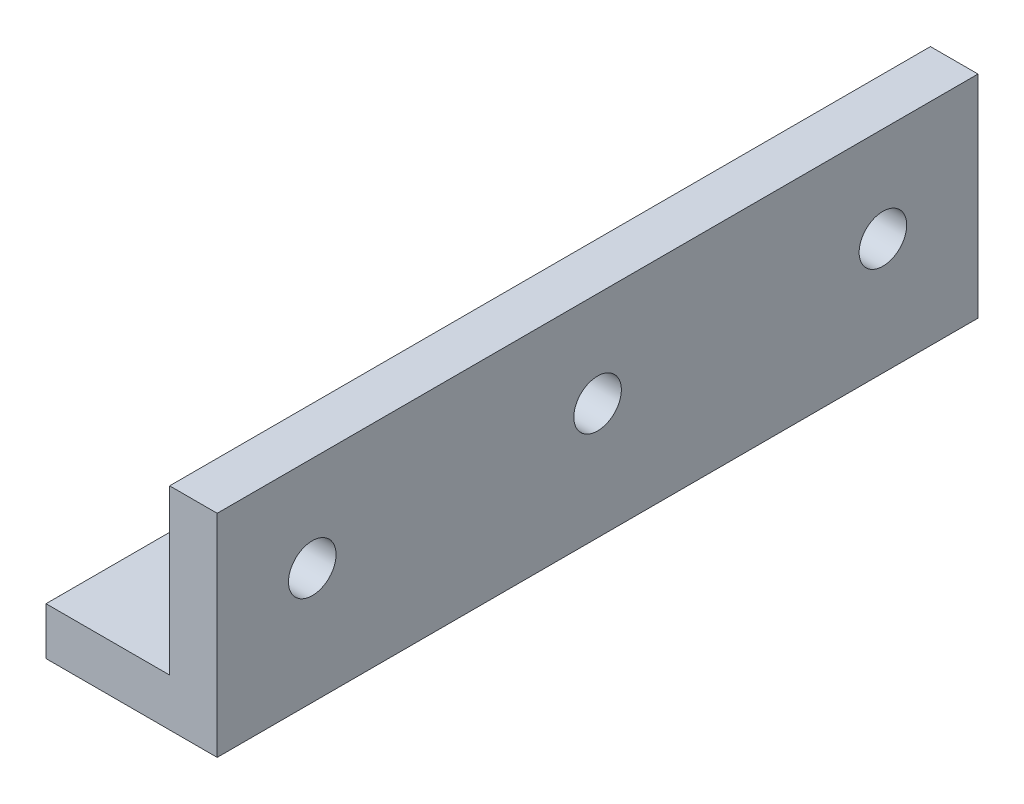
ISO-10303-21;
HEADER;
FILE_DESCRIPTION(('STEP AP214'),'2;1');
FILE_NAME('part.step','',(''),(''),'','','');
FILE_SCHEMA(('AUTOMOTIVE_DESIGN { 1 0 10303 214 1 1 1 1 }'));
ENDSEC;
DATA;
#1=APPLICATION_CONTEXT('core data for automotive mechanical design processes');
#2=APPLICATION_PROTOCOL_DEFINITION('international standard','automotive_design',2000,#1);
#3=PRODUCT_CONTEXT('',#1,'mechanical');
#4=PRODUCT('Part','Part','',(#3));
#5=PRODUCT_RELATED_PRODUCT_CATEGORY('part','',(#4));
#6=PRODUCT_DEFINITION_FORMATION('','',#4);
#7=PRODUCT_DEFINITION_CONTEXT('part definition',#1,'design');
#8=PRODUCT_DEFINITION('design','',#6,#7);
#9=PRODUCT_DEFINITION_SHAPE('','',#8);
#10=(LENGTH_UNIT() NAMED_UNIT(*) SI_UNIT(.MILLI.,.METRE.));
#11=(NAMED_UNIT(*) PLANE_ANGLE_UNIT() SI_UNIT($,.RADIAN.));
#12=(NAMED_UNIT(*) SI_UNIT($,.STERADIAN.) SOLID_ANGLE_UNIT());
#13=UNCERTAINTY_MEASURE_WITH_UNIT(LENGTH_MEASURE(1.E-05),#10,'distance_accuracy_value','');
#14=(GEOMETRIC_REPRESENTATION_CONTEXT(3) GLOBAL_UNCERTAINTY_ASSIGNED_CONTEXT((#13)) GLOBAL_UNIT_ASSIGNED_CONTEXT((#10,
#11,#12)) REPRESENTATION_CONTEXT('',''));
#15=CARTESIAN_POINT('',(0.,0.,0.));
#16=DIRECTION('',(0.,0.,1.));
#17=DIRECTION('',(1.,0.,0.));
#18=AXIS2_PLACEMENT_3D('',#15,#16,#17);
#19=CARTESIAN_POINT('',(0.,6.35,0.));
#20=DIRECTION('',(0.,-1.,0.));
#21=DIRECTION('',(0.,0.,-1.));
#22=AXIS2_PLACEMENT_3D('',#19,#20,#21);
#23=PLANE('',#22);
#24=CARTESIAN_POINT('',(10.16,6.35,69.85));
#25=DIRECTION('',(0.,1.,0.));
#26=DIRECTION('',(0.,0.,1.));
#27=AXIS2_PLACEMENT_3D('',#24,#25,#26);
#28=CIRCLE('',#27,3.175);
#29=CARTESIAN_POINT('',(10.16,6.35,73.025));
#30=VERTEX_POINT('',#29);
#31=EDGE_CURVE('E173',#30,#30,#28,.T.);
#32=ORIENTED_EDGE('',*,*,#31,.F.);
#33=EDGE_LOOP('',(#32));
#34=FACE_BOUND('',#33,.T.);
#35=CARTESIAN_POINT('',(10.16,6.35,31.75));
#36=DIRECTION('',(0.,1.,0.));
#37=DIRECTION('',(0.,0.,1.));
#38=AXIS2_PLACEMENT_3D('',#35,#36,#37);
#39=CIRCLE('',#38,3.175);
#40=CARTESIAN_POINT('',(10.16,6.35,34.925));
#41=VERTEX_POINT('',#40);
#42=EDGE_CURVE('E167',#41,#41,#39,.T.);
#43=ORIENTED_EDGE('',*,*,#42,.F.);
#44=EDGE_LOOP('',(#43));
#45=FACE_BOUND('',#44,.T.);
#46=DIRECTION('',(0.,0.,1.));
#47=VECTOR('',#46,1.);
#48=CARTESIAN_POINT('',(16.51,6.35,101.6));
#49=LINE('',#48,#47);
#50=CARTESIAN_POINT('',(16.51,6.35,0.));
#51=VERTEX_POINT('',#50);
#52=CARTESIAN_POINT('',(16.51,6.35,101.6));
#53=VERTEX_POINT('',#52);
#54=EDGE_CURVE('E49',#51,#53,#49,.T.);
#55=ORIENTED_EDGE('',*,*,#54,.F.);
#56=DIRECTION('',(-1.,0.,0.));
#57=VECTOR('',#56,1.);
#58=CARTESIAN_POINT('',(0.,6.35,0.));
#59=LINE('',#58,#57);
#60=CARTESIAN_POINT('',(0.,6.35,0.));
#61=VERTEX_POINT('',#60);
#62=EDGE_CURVE('E54',#51,#61,#59,.T.);
#63=ORIENTED_EDGE('',*,*,#62,.T.);
#64=DIRECTION('',(0.,0.,1.));
#65=VECTOR('',#64,1.);
#66=CARTESIAN_POINT('',(0.,6.35,101.6));
#67=LINE('',#66,#65);
#68=CARTESIAN_POINT('',(0.,6.35,101.6));
#69=VERTEX_POINT('',#68);
#70=EDGE_CURVE('E85',#61,#69,#67,.T.);
#71=ORIENTED_EDGE('',*,*,#70,.T.);
#72=DIRECTION('',(1.,0.,0.));
#73=VECTOR('',#72,1.);
#74=CARTESIAN_POINT('',(22.86,6.35,101.6));
#75=LINE('',#74,#73);
#76=EDGE_CURVE('E136',#69,#53,#75,.T.);
#77=ORIENTED_EDGE('',*,*,#76,.T.);
#78=EDGE_LOOP('',(#55,#63,#71,#77));
#79=FACE_BOUND('',#78,.T.);
#80=ADVANCED_FACE('F34',(#34,#45,#79),#23,.F.);
#81=CARTESIAN_POINT('',(0.,6.35,101.6));
#82=DIRECTION('',(1.,0.,0.));
#83=DIRECTION('',(0.,0.,-1.));
#84=AXIS2_PLACEMENT_3D('',#81,#82,#83);
#85=PLANE('',#84);
#86=DIRECTION('',(0.,0.,1.));
#87=VECTOR('',#86,1.);
#88=CARTESIAN_POINT('',(0.,0.,101.6));
#89=LINE('',#88,#87);
#90=CARTESIAN_POINT('',(0.,0.,0.));
#91=VERTEX_POINT('',#90);
#92=CARTESIAN_POINT('',(0.,0.,101.6));
#93=VERTEX_POINT('',#92);
#94=EDGE_CURVE('E91',#91,#93,#89,.T.);
#95=ORIENTED_EDGE('',*,*,#94,.T.);
#96=DIRECTION('',(0.,-1.,0.));
#97=VECTOR('',#96,1.);
#98=CARTESIAN_POINT('',(0.,6.35,101.6));
#99=LINE('',#98,#97);
#100=EDGE_CURVE('E11',#69,#93,#99,.T.);
#101=ORIENTED_EDGE('',*,*,#100,.F.);
#102=ORIENTED_EDGE('',*,*,#70,.F.);
#103=DIRECTION('',(0.,-1.,0.));
#104=VECTOR('',#103,1.);
#105=CARTESIAN_POINT('',(0.,6.35,0.));
#106=LINE('',#105,#104);
#107=EDGE_CURVE('E77',#61,#91,#106,.T.);
#108=ORIENTED_EDGE('',*,*,#107,.T.);
#109=EDGE_LOOP('',(#95,#101,#102,#108));
#110=FACE_BOUND('',#109,.T.);
#111=ADVANCED_FACE('F36',(#110),#85,.F.);
#112=CARTESIAN_POINT('',(22.86,6.35,101.6));
#113=DIRECTION('',(0.,0.,-1.));
#114=DIRECTION('',(-1.,0.,0.));
#115=AXIS2_PLACEMENT_3D('',#112,#113,#114);
#116=PLANE('',#115);
#117=DIRECTION('',(1.,0.,0.));
#118=VECTOR('',#117,1.);
#119=CARTESIAN_POINT('',(22.86,0.,101.6));
#120=LINE('',#119,#118);
#121=CARTESIAN_POINT('',(22.86,0.,101.6));
#122=VERTEX_POINT('',#121);
#123=EDGE_CURVE('E94',#93,#122,#120,.T.);
#124=ORIENTED_EDGE('',*,*,#123,.T.);
#125=DIRECTION('',(0.,-1.,0.));
#126=VECTOR('',#125,1.);
#127=CARTESIAN_POINT('',(22.86,6.35,101.6));
#128=LINE('',#127,#126);
#129=CARTESIAN_POINT('',(22.86,28.23544518,101.6));
#130=VERTEX_POINT('',#129);
#131=EDGE_CURVE('E42',#130,#122,#128,.T.);
#132=ORIENTED_EDGE('',*,*,#131,.F.);
#133=DIRECTION('',(1.,0.,0.));
#134=VECTOR('',#133,1.);
#135=CARTESIAN_POINT('',(22.86,28.23544518,101.6));
#136=LINE('',#135,#134);
#137=CARTESIAN_POINT('',(16.51,28.23544518,101.6));
#138=VERTEX_POINT('',#137);
#139=EDGE_CURVE('E118',#138,#130,#136,.T.);
#140=ORIENTED_EDGE('',*,*,#139,.F.);
#141=DIRECTION('',(0.,-1.,0.));
#142=VECTOR('',#141,1.);
#143=CARTESIAN_POINT('',(16.51,28.23544518,101.6));
#144=LINE('',#143,#142);
#145=EDGE_CURVE('E99',#138,#53,#144,.T.);
#146=ORIENTED_EDGE('',*,*,#145,.T.);
#147=ORIENTED_EDGE('',*,*,#76,.F.);
#148=ORIENTED_EDGE('',*,*,#100,.T.);
#149=EDGE_LOOP('',(#124,#132,#140,#146,#147,#148));
#150=FACE_BOUND('',#149,.T.);
#151=ADVANCED_FACE('F115',(#150),#116,.F.);
#152=CARTESIAN_POINT('',(22.86,6.35,0.));
#153=DIRECTION('',(-1.,0.,0.));
#154=DIRECTION('',(0.,0.,1.));
#155=AXIS2_PLACEMENT_3D('',#152,#153,#154);
#156=PLANE('',#155);
#157=CARTESIAN_POINT('',(22.86,15.53544518,50.8));
#158=DIRECTION('',(-1.,0.,0.));
#159=DIRECTION('',(0.,0.,1.));
#160=AXIS2_PLACEMENT_3D('',#157,#158,#159);
#161=CIRCLE('',#160,3.175);
#162=CARTESIAN_POINT('',(22.86,15.53544518,53.975));
#163=VERTEX_POINT('',#162);
#164=EDGE_CURVE('E152',#163,#163,#161,.F.);
#165=ORIENTED_EDGE('',*,*,#164,.F.);
#166=EDGE_LOOP('',(#165));
#167=FACE_BOUND('',#166,.T.);
#168=CARTESIAN_POINT('',(22.86,15.53544518,12.7));
#169=DIRECTION('',(-1.,0.,0.));
#170=DIRECTION('',(0.,0.,1.));
#171=AXIS2_PLACEMENT_3D('',#168,#169,#170);
#172=CIRCLE('',#171,3.175);
#173=CARTESIAN_POINT('',(22.86,15.53544518,15.875));
#174=VERTEX_POINT('',#173);
#175=EDGE_CURVE('E153',#174,#174,#172,.F.);
#176=ORIENTED_EDGE('',*,*,#175,.F.);
#177=EDGE_LOOP('',(#176));
#178=FACE_BOUND('',#177,.T.);
#179=CARTESIAN_POINT('',(22.86,15.53544518,88.9));
#180=DIRECTION('',(-1.,0.,0.));
#181=DIRECTION('',(0.,0.,1.));
#182=AXIS2_PLACEMENT_3D('',#179,#180,#181);
#183=CIRCLE('',#182,3.175);
#184=CARTESIAN_POINT('',(22.86,15.53544518,92.075));
#185=VERTEX_POINT('',#184);
#186=EDGE_CURVE('E134',#185,#185,#183,.F.);
#187=ORIENTED_EDGE('',*,*,#186,.F.);
#188=EDGE_LOOP('',(#187));
#189=FACE_BOUND('',#188,.T.);
#190=DIRECTION('',(0.,0.,-1.));
#191=VECTOR('',#190,1.);
#192=CARTESIAN_POINT('',(22.86,0.,0.));
#193=LINE('',#192,#191);
#194=CARTESIAN_POINT('',(22.86,0.,0.));
#195=VERTEX_POINT('',#194);
#196=EDGE_CURVE('E86',#122,#195,#193,.T.);
#197=ORIENTED_EDGE('',*,*,#196,.T.);
#198=DIRECTION('',(0.,-1.,0.));
#199=VECTOR('',#198,1.);
#200=CARTESIAN_POINT('',(22.86,6.35,0.));
#201=LINE('',#200,#199);
#202=CARTESIAN_POINT('',(22.86,28.23544518,0.));
#203=VERTEX_POINT('',#202);
#204=EDGE_CURVE('E81',#203,#195,#201,.T.);
#205=ORIENTED_EDGE('',*,*,#204,.F.);
#206=DIRECTION('',(0.,0.,-1.));
#207=VECTOR('',#206,1.);
#208=CARTESIAN_POINT('',(22.86,28.23544518,101.6));
#209=LINE('',#208,#207);
#210=EDGE_CURVE('E111',#130,#203,#209,.T.);
#211=ORIENTED_EDGE('',*,*,#210,.F.);
#212=ORIENTED_EDGE('',*,*,#131,.T.);
#213=EDGE_LOOP('',(#197,#205,#211,#212));
#214=FACE_BOUND('',#213,.T.);
#215=ADVANCED_FACE('F109',(#167,#178,#189,#214),#156,.F.);
#216=CARTESIAN_POINT('',(0.,6.35,0.));
#217=DIRECTION('',(0.,0.,1.));
#218=DIRECTION('',(1.,0.,0.));
#219=AXIS2_PLACEMENT_3D('',#216,#217,#218);
#220=PLANE('',#219);
#221=DIRECTION('',(-1.,0.,0.));
#222=VECTOR('',#221,1.);
#223=CARTESIAN_POINT('',(0.,0.,0.));
#224=LINE('',#223,#222);
#225=EDGE_CURVE('E74',#195,#91,#224,.T.);
#226=ORIENTED_EDGE('',*,*,#225,.T.);
#227=ORIENTED_EDGE('',*,*,#107,.F.);
#228=ORIENTED_EDGE('',*,*,#62,.F.);
#229=DIRECTION('',(0.,-1.,0.));
#230=VECTOR('',#229,1.);
#231=CARTESIAN_POINT('',(16.51,28.23544518,0.));
#232=LINE('',#231,#230);
#233=CARTESIAN_POINT('',(16.51,28.23544518,0.));
#234=VERTEX_POINT('',#233);
#235=EDGE_CURVE('E95',#234,#51,#232,.T.);
#236=ORIENTED_EDGE('',*,*,#235,.F.);
#237=DIRECTION('',(-1.,0.,0.));
#238=VECTOR('',#237,1.);
#239=CARTESIAN_POINT('',(22.86,28.23544518,0.));
#240=LINE('',#239,#238);
#241=EDGE_CURVE('E130',#203,#234,#240,.T.);
#242=ORIENTED_EDGE('',*,*,#241,.F.);
#243=ORIENTED_EDGE('',*,*,#204,.T.);
#244=EDGE_LOOP('',(#226,#227,#228,#236,#242,#243));
#245=FACE_BOUND('',#244,.T.);
#246=ADVANCED_FACE('F76',(#245),#220,.F.);
#247=CARTESIAN_POINT('',(0.,0.,0.));
#248=DIRECTION('',(0.,-1.,0.));
#249=DIRECTION('',(0.,0.,-1.));
#250=AXIS2_PLACEMENT_3D('',#247,#248,#249);
#251=PLANE('',#250);
#252=CARTESIAN_POINT('',(10.16,0.,69.85));
#253=DIRECTION('',(0.,-1.,0.));
#254=DIRECTION('',(0.,0.,-1.));
#255=AXIS2_PLACEMENT_3D('',#252,#253,#254);
#256=CIRCLE('',#255,3.175);
#257=CARTESIAN_POINT('',(10.16,0.,66.675));
#258=VERTEX_POINT('',#257);
#259=EDGE_CURVE('E170',#258,#258,#256,.F.);
#260=ORIENTED_EDGE('',*,*,#259,.T.);
#261=EDGE_LOOP('',(#260));
#262=FACE_BOUND('',#261,.T.);
#263=CARTESIAN_POINT('',(10.16,0.,31.75));
#264=DIRECTION('',(0.,-1.,0.));
#265=DIRECTION('',(0.,0.,-1.));
#266=AXIS2_PLACEMENT_3D('',#263,#264,#265);
#267=CIRCLE('',#266,3.175);
#268=CARTESIAN_POINT('',(10.16,0.,28.575));
#269=VERTEX_POINT('',#268);
#270=EDGE_CURVE('E160',#269,#269,#267,.F.);
#271=ORIENTED_EDGE('',*,*,#270,.T.);
#272=EDGE_LOOP('',(#271));
#273=FACE_BOUND('',#272,.T.);
#274=ORIENTED_EDGE('',*,*,#94,.F.);
#275=ORIENTED_EDGE('',*,*,#225,.F.);
#276=ORIENTED_EDGE('',*,*,#196,.F.);
#277=ORIENTED_EDGE('',*,*,#123,.F.);
#278=EDGE_LOOP('',(#274,#275,#276,#277));
#279=FACE_BOUND('',#278,.T.);
#280=ADVANCED_FACE('F93',(#262,#273,#279),#251,.T.);
#281=CARTESIAN_POINT('',(16.51,28.23544518,101.6));
#282=DIRECTION('',(1.,0.,0.));
#283=DIRECTION('',(0.,0.,-1.));
#284=AXIS2_PLACEMENT_3D('',#281,#282,#283);
#285=PLANE('',#284);
#286=CARTESIAN_POINT('',(16.51,15.53544518,50.8));
#287=DIRECTION('',(-1.,0.,0.));
#288=DIRECTION('',(0.,0.,1.));
#289=AXIS2_PLACEMENT_3D('',#286,#287,#288);
#290=CIRCLE('',#289,3.175);
#291=CARTESIAN_POINT('',(16.51,15.53544518,53.975));
#292=VERTEX_POINT('',#291);
#293=EDGE_CURVE('E156',#292,#292,#290,.T.);
#294=ORIENTED_EDGE('',*,*,#293,.F.);
#295=EDGE_LOOP('',(#294));
#296=FACE_BOUND('',#295,.T.);
#297=CARTESIAN_POINT('',(16.51,15.53544518,12.7));
#298=DIRECTION('',(-1.,0.,0.));
#299=DIRECTION('',(0.,0.,1.));
#300=AXIS2_PLACEMENT_3D('',#297,#298,#299);
#301=CIRCLE('',#300,3.175);
#302=CARTESIAN_POINT('',(16.51,15.53544518,15.875));
#303=VERTEX_POINT('',#302);
#304=EDGE_CURVE('E157',#303,#303,#301,.T.);
#305=ORIENTED_EDGE('',*,*,#304,.F.);
#306=EDGE_LOOP('',(#305));
#307=FACE_BOUND('',#306,.T.);
#308=CARTESIAN_POINT('',(16.51,15.53544518,88.9));
#309=DIRECTION('',(-1.,0.,0.));
#310=DIRECTION('',(0.,0.,1.));
#311=AXIS2_PLACEMENT_3D('',#308,#309,#310);
#312=CIRCLE('',#311,3.175);
#313=CARTESIAN_POINT('',(16.51,15.53544518,92.075));
#314=VERTEX_POINT('',#313);
#315=EDGE_CURVE('E149',#314,#314,#312,.T.);
#316=ORIENTED_EDGE('',*,*,#315,.F.);
#317=EDGE_LOOP('',(#316));
#318=FACE_BOUND('',#317,.T.);
#319=ORIENTED_EDGE('',*,*,#54,.T.);
#320=ORIENTED_EDGE('',*,*,#145,.F.);
#321=DIRECTION('',(0.,0.,1.));
#322=VECTOR('',#321,1.);
#323=CARTESIAN_POINT('',(16.51,28.23544518,101.6));
#324=LINE('',#323,#322);
#325=EDGE_CURVE('E126',#234,#138,#324,.T.);
#326=ORIENTED_EDGE('',*,*,#325,.F.);
#327=ORIENTED_EDGE('',*,*,#235,.T.);
#328=EDGE_LOOP('',(#319,#320,#326,#327));
#329=FACE_BOUND('',#328,.T.);
#330=ADVANCED_FACE('F139',(#296,#307,#318,#329),#285,.F.);
#331=CARTESIAN_POINT('',(0.,28.23544518,0.));
#332=DIRECTION('',(0.,1.,0.));
#333=DIRECTION('',(0.,0.,1.));
#334=AXIS2_PLACEMENT_3D('',#331,#332,#333);
#335=PLANE('',#334);
#336=ORIENTED_EDGE('',*,*,#210,.T.);
#337=ORIENTED_EDGE('',*,*,#241,.T.);
#338=ORIENTED_EDGE('',*,*,#325,.T.);
#339=ORIENTED_EDGE('',*,*,#139,.T.);
#340=EDGE_LOOP('',(#336,#337,#338,#339));
#341=FACE_BOUND('',#340,.T.);
#342=ADVANCED_FACE('F122',(#341),#335,.T.);
#343=CARTESIAN_POINT('',(31.8402561210692,15.53544518,88.9));
#344=DIRECTION('',(-1.,0.,0.));
#345=DIRECTION('',(0.,0.,1.));
#346=AXIS2_PLACEMENT_3D('',#343,#344,#345);
#347=CYLINDRICAL_SURFACE('',#346,3.175);
#348=ORIENTED_EDGE('',*,*,#186,.T.);
#349=EDGE_LOOP('',(#348));
#350=FACE_BOUND('',#349,.T.);
#351=ORIENTED_EDGE('',*,*,#315,.T.);
#352=EDGE_LOOP('',(#351));
#353=FACE_BOUND('',#352,.T.);
#354=ADVANCED_FACE('F250',(#350,#353),#347,.F.);
#355=CARTESIAN_POINT('',(31.8402561210692,15.53544518,12.7));
#356=DIRECTION('',(-1.,0.,0.));
#357=DIRECTION('',(0.,0.,1.));
#358=AXIS2_PLACEMENT_3D('',#355,#356,#357);
#359=CYLINDRICAL_SURFACE('',#358,3.175);
#360=ORIENTED_EDGE('',*,*,#175,.T.);
#361=EDGE_LOOP('',(#360));
#362=FACE_BOUND('',#361,.T.);
#363=ORIENTED_EDGE('',*,*,#304,.T.);
#364=EDGE_LOOP('',(#363));
#365=FACE_BOUND('',#364,.T.);
#366=ADVANCED_FACE('F246',(#362,#365),#359,.F.);
#367=CARTESIAN_POINT('',(31.8402561210692,15.53544518,50.8));
#368=DIRECTION('',(-1.,0.,0.));
#369=DIRECTION('',(0.,0.,1.));
#370=AXIS2_PLACEMENT_3D('',#367,#368,#369);
#371=CYLINDRICAL_SURFACE('',#370,3.175);
#372=ORIENTED_EDGE('',*,*,#164,.T.);
#373=EDGE_LOOP('',(#372));
#374=FACE_BOUND('',#373,.T.);
#375=ORIENTED_EDGE('',*,*,#293,.T.);
#376=EDGE_LOOP('',(#375));
#377=FACE_BOUND('',#376,.T.);
#378=ADVANCED_FACE('F188',(#374,#377),#371,.F.);
#379=CARTESIAN_POINT('',(10.16,-8.98025612106915,31.75));
#380=DIRECTION('',(0.,1.,0.));
#381=DIRECTION('',(0.,0.,1.));
#382=AXIS2_PLACEMENT_3D('',#379,#380,#381);
#383=CYLINDRICAL_SURFACE('',#382,3.175);
#384=ORIENTED_EDGE('',*,*,#42,.T.);
#385=EDGE_LOOP('',(#384));
#386=FACE_BOUND('',#385,.T.);
#387=ORIENTED_EDGE('',*,*,#270,.F.);
#388=EDGE_LOOP('',(#387));
#389=FACE_BOUND('',#388,.T.);
#390=ADVANCED_FACE('F185',(#386,#389),#383,.F.);
#391=CARTESIAN_POINT('',(10.16,-8.98025612106915,69.85));
#392=DIRECTION('',(0.,1.,0.));
#393=DIRECTION('',(0.,0.,1.));
#394=AXIS2_PLACEMENT_3D('',#391,#392,#393);
#395=CYLINDRICAL_SURFACE('',#394,3.175);
#396=ORIENTED_EDGE('',*,*,#31,.T.);
#397=EDGE_LOOP('',(#396));
#398=FACE_BOUND('',#397,.T.);
#399=ORIENTED_EDGE('',*,*,#259,.F.);
#400=EDGE_LOOP('',(#399));
#401=FACE_BOUND('',#400,.T.);
#402=ADVANCED_FACE('F177',(#398,#401),#395,.F.);
#403=CLOSED_SHELL('',(#80,#111,#151,#215,#246,#280,#330,#342,#354,#366,#378,#390,#402));
#404=MANIFOLD_SOLID_BREP('B2',#403);
#405=ADVANCED_BREP_SHAPE_REPRESENTATION('',(#18,#404),#14);
#406=SHAPE_DEFINITION_REPRESENTATION(#9,#405);
ENDSEC;
END-ISO-10303-21;
